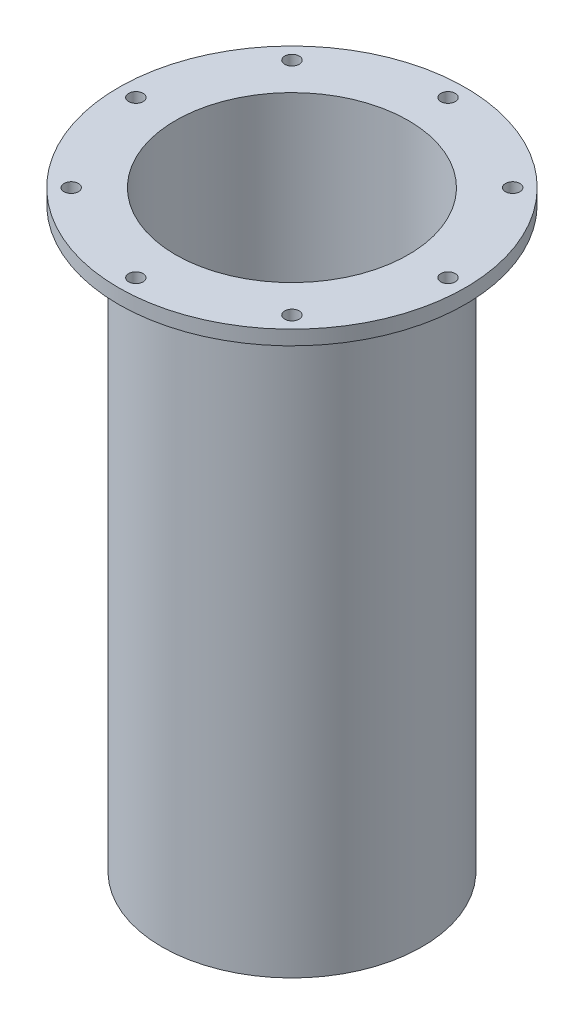
ISO-10303-21;
HEADER;
FILE_DESCRIPTION(('STEP AP214'),'2;1');
FILE_NAME('part.step','',(''),(''),'','','');
FILE_SCHEMA(('AUTOMOTIVE_DESIGN { 1 0 10303 214 1 1 1 1 }'));
ENDSEC;
DATA;
#1=APPLICATION_CONTEXT('core data for automotive mechanical design processes');
#2=APPLICATION_PROTOCOL_DEFINITION('international standard','automotive_design',2000,#1);
#3=PRODUCT_CONTEXT('',#1,'mechanical');
#4=PRODUCT('Part','Part','',(#3));
#5=PRODUCT_RELATED_PRODUCT_CATEGORY('part','',(#4));
#6=PRODUCT_DEFINITION_FORMATION('','',#4);
#7=PRODUCT_DEFINITION_CONTEXT('part definition',#1,'design');
#8=PRODUCT_DEFINITION('design','',#6,#7);
#9=PRODUCT_DEFINITION_SHAPE('','',#8);
#10=(LENGTH_UNIT() NAMED_UNIT(*) SI_UNIT(.MILLI.,.METRE.));
#11=(NAMED_UNIT(*) PLANE_ANGLE_UNIT() SI_UNIT($,.RADIAN.));
#12=(NAMED_UNIT(*) SI_UNIT($,.STERADIAN.) SOLID_ANGLE_UNIT());
#13=UNCERTAINTY_MEASURE_WITH_UNIT(LENGTH_MEASURE(1.E-05),#10,'distance_accuracy_value','');
#14=(GEOMETRIC_REPRESENTATION_CONTEXT(3) GLOBAL_UNCERTAINTY_ASSIGNED_CONTEXT((#13)) GLOBAL_UNIT_ASSIGNED_CONTEXT((#10,
#11,#12)) REPRESENTATION_CONTEXT('',''));
#15=CARTESIAN_POINT('',(0.,0.,0.));
#16=DIRECTION('',(0.,0.,1.));
#17=DIRECTION('',(1.,0.,0.));
#18=AXIS2_PLACEMENT_3D('',#15,#16,#17);
#19=CARTESIAN_POINT('',(0.,-260.35,0.));
#20=DIRECTION('',(0.,1.,0.));
#21=DIRECTION('',(0.,0.,1.));
#22=AXIS2_PLACEMENT_3D('',#19,#20,#21);
#23=CYLINDRICAL_SURFACE('',#22,57.15);
#24=CARTESIAN_POINT('',(0.,-260.35,0.));
#25=DIRECTION('',(0.,1.,0.));
#26=DIRECTION('',(0.,0.,1.));
#27=AXIS2_PLACEMENT_3D('',#24,#25,#26);
#28=CIRCLE('',#27,57.15);
#29=CARTESIAN_POINT('',(0.,-260.35,57.15));
#30=VERTEX_POINT('',#29);
#31=EDGE_CURVE('E10',#30,#30,#28,.T.);
#32=ORIENTED_EDGE('',*,*,#31,.T.);
#33=EDGE_LOOP('',(#32));
#34=FACE_BOUND('',#33,.T.);
#35=CARTESIAN_POINT('',(0.,-6.35000000000002,0.));
#36=DIRECTION('',(0.,1.,0.));
#37=DIRECTION('',(0.,0.,1.));
#38=AXIS2_PLACEMENT_3D('',#35,#36,#37);
#39=CIRCLE('',#38,57.15);
#40=CARTESIAN_POINT('',(0.,-6.35000000000002,57.15));
#41=VERTEX_POINT('',#40);
#42=EDGE_CURVE('E38',#41,#41,#39,.F.);
#43=ORIENTED_EDGE('',*,*,#42,.T.);
#44=EDGE_LOOP('',(#43));
#45=FACE_BOUND('',#44,.T.);
#46=ADVANCED_FACE('F35',(#34,#45),#23,.T.);
#47=CARTESIAN_POINT('',(0.,-260.35,0.));
#48=DIRECTION('',(0.,1.,0.));
#49=DIRECTION('',(0.,0.,1.));
#50=AXIS2_PLACEMENT_3D('',#47,#48,#49);
#51=PLANE('',#50);
#52=CARTESIAN_POINT('',(0.,-260.35,0.));
#53=DIRECTION('',(0.,1.,0.));
#54=DIRECTION('',(0.,0.,1.));
#55=AXIS2_PLACEMENT_3D('',#52,#53,#54);
#56=CIRCLE('',#55,51.1302);
#57=CARTESIAN_POINT('',(0.,-260.35,51.1302));
#58=VERTEX_POINT('',#57);
#59=EDGE_CURVE('E42',#58,#58,#56,.T.);
#60=ORIENTED_EDGE('',*,*,#59,.T.);
#61=EDGE_LOOP('',(#60));
#62=FACE_BOUND('',#61,.T.);
#63=ORIENTED_EDGE('',*,*,#31,.F.);
#64=EDGE_LOOP('',(#63));
#65=FACE_BOUND('',#64,.T.);
#66=ADVANCED_FACE('F113',(#62,#65),#51,.F.);
#67=CARTESIAN_POINT('',(0.,0.,0.));
#68=DIRECTION('',(0.,1.,0.));
#69=DIRECTION('',(0.,0.,1.));
#70=AXIS2_PLACEMENT_3D('',#67,#68,#69);
#71=PLANE('',#70);
#72=CARTESIAN_POINT('',(68.58,0.,2.39445790217862E-13));
#73=DIRECTION('',(0.,1.,0.));
#74=DIRECTION('',(-1.,0.,0.));
#75=AXIS2_PLACEMENT_3D('',#72,#73,#74);
#76=CIRCLE('',#75,3.175);
#77=CARTESIAN_POINT('',(65.405,0.,2.28360336967035E-13));
#78=VERTEX_POINT('',#77);
#79=EDGE_CURVE('E87',#78,#78,#76,.T.);
#80=ORIENTED_EDGE('',*,*,#79,.F.);
#81=EDGE_LOOP('',(#80));
#82=FACE_BOUND('',#81,.T.);
#83=CARTESIAN_POINT('',(48.4933830537732,0.,48.4933830537737));
#84=DIRECTION('',(0.,1.,0.));
#85=DIRECTION('',(-0.707106781186544,0.,-0.707106781186551));
#86=AXIS2_PLACEMENT_3D('',#83,#84,#85);
#87=CIRCLE('',#86,3.175);
#88=CARTESIAN_POINT('',(46.2483190235059,0.,46.2483190235064));
#89=VERTEX_POINT('',#88);
#90=EDGE_CURVE('E81',#89,#89,#87,.T.);
#91=ORIENTED_EDGE('',*,*,#90,.F.);
#92=EDGE_LOOP('',(#91));
#93=FACE_BOUND('',#92,.T.);
#94=CARTESIAN_POINT('',(0.,0.,68.58));
#95=DIRECTION('',(0.,1.,0.));
#96=DIRECTION('',(0.,0.,-1.));
#97=AXIS2_PLACEMENT_3D('',#94,#95,#96);
#98=CIRCLE('',#97,3.175);
#99=CARTESIAN_POINT('',(0.,0.,65.405));
#100=VERTEX_POINT('',#99);
#101=EDGE_CURVE('E73',#100,#100,#98,.T.);
#102=ORIENTED_EDGE('',*,*,#101,.F.);
#103=EDGE_LOOP('',(#102));
#104=FACE_BOUND('',#103,.T.);
#105=CARTESIAN_POINT('',(-48.4933830537739,0.,48.493383053773));
#106=DIRECTION('',(0.,1.,0.));
#107=DIRECTION('',(0.707106781186554,0.,-0.707106781186541));
#108=AXIS2_PLACEMENT_3D('',#105,#106,#107);
#109=CIRCLE('',#108,3.175);
#110=CARTESIAN_POINT('',(-46.2483190235065,0.,46.2483190235057));
#111=VERTEX_POINT('',#110);
#112=EDGE_CURVE('E74',#111,#111,#109,.T.);
#113=ORIENTED_EDGE('',*,*,#112,.F.);
#114=EDGE_LOOP('',(#113));
#115=FACE_BOUND('',#114,.T.);
#116=CARTESIAN_POINT('',(-68.58,0.,-7.18337370653586E-13));
#117=DIRECTION('',(0.,1.,0.));
#118=DIRECTION('',(1.,0.,0.));
#119=AXIS2_PLACEMENT_3D('',#116,#117,#118);
#120=CIRCLE('',#119,3.175);
#121=CARTESIAN_POINT('',(-65.405,0.,-6.85081010901105E-13));
#122=VERTEX_POINT('',#121);
#123=EDGE_CURVE('E97',#122,#122,#120,.T.);
#124=ORIENTED_EDGE('',*,*,#123,.F.);
#125=EDGE_LOOP('',(#124));
#126=FACE_BOUND('',#125,.T.);
#127=CARTESIAN_POINT('',(-48.4933830537728,0.,-48.493383053774));
#128=DIRECTION('',(0.,1.,0.));
#129=DIRECTION('',(0.707106781186539,0.,0.707106781186556));
#130=AXIS2_PLACEMENT_3D('',#127,#128,#129);
#131=CIRCLE('',#130,3.175);
#132=CARTESIAN_POINT('',(-46.2483190235056,0.,-46.2483190235067));
#133=VERTEX_POINT('',#132);
#134=EDGE_CURVE('E98',#133,#133,#131,.T.);
#135=ORIENTED_EDGE('',*,*,#134,.F.);
#136=EDGE_LOOP('',(#135));
#137=FACE_BOUND('',#136,.T.);
#138=CARTESIAN_POINT('',(48.4933830537735,0.,-48.4933830537733));
#139=DIRECTION('',(0.,1.,0.));
#140=DIRECTION('',(-0.707106781186549,0.,0.707106781186546));
#141=AXIS2_PLACEMENT_3D('',#138,#139,#140);
#142=CIRCLE('',#141,3.175);
#143=CARTESIAN_POINT('',(46.2483190235062,0.,-46.2483190235061));
#144=VERTEX_POINT('',#143);
#145=EDGE_CURVE('E66',#144,#144,#142,.T.);
#146=ORIENTED_EDGE('',*,*,#145,.F.);
#147=EDGE_LOOP('',(#146));
#148=FACE_BOUND('',#147,.T.);
#149=CARTESIAN_POINT('',(0.,0.,-68.58));
#150=DIRECTION('',(0.,1.,0.));
#151=DIRECTION('',(0.,0.,1.));
#152=AXIS2_PLACEMENT_3D('',#149,#150,#151);
#153=CIRCLE('',#152,3.175);
#154=CARTESIAN_POINT('',(0.,0.,-65.405));
#155=VERTEX_POINT('',#154);
#156=EDGE_CURVE('E60',#155,#155,#153,.T.);
#157=ORIENTED_EDGE('',*,*,#156,.F.);
#158=EDGE_LOOP('',(#157));
#159=FACE_BOUND('',#158,.T.);
#160=CARTESIAN_POINT('',(0.,0.,0.));
#161=DIRECTION('',(0.,1.,0.));
#162=DIRECTION('',(0.,0.,1.));
#163=AXIS2_PLACEMENT_3D('',#160,#161,#162);
#164=CIRCLE('',#163,51.1302);
#165=CARTESIAN_POINT('',(0.,0.,51.1302));
#166=VERTEX_POINT('',#165);
#167=EDGE_CURVE('E46',#166,#166,#164,.T.);
#168=ORIENTED_EDGE('',*,*,#167,.F.);
#169=EDGE_LOOP('',(#168));
#170=FACE_BOUND('',#169,.T.);
#171=CARTESIAN_POINT('',(0.,0.,0.));
#172=DIRECTION('',(0.,1.,0.));
#173=DIRECTION('',(0.,0.,1.));
#174=AXIS2_PLACEMENT_3D('',#171,#172,#173);
#175=CIRCLE('',#174,76.2);
#176=CARTESIAN_POINT('',(0.,0.,76.2));
#177=VERTEX_POINT('',#176);
#178=EDGE_CURVE('E51',#177,#177,#175,.T.);
#179=ORIENTED_EDGE('',*,*,#178,.T.);
#180=EDGE_LOOP('',(#179));
#181=FACE_BOUND('',#180,.T.);
#182=ADVANCED_FACE('F109',(#82,#93,#104,#115,#126,#137,#148,#159,#170,#181),#71,.T.);
#183=CARTESIAN_POINT('',(0.,-260.35,0.));
#184=DIRECTION('',(0.,1.,0.));
#185=DIRECTION('',(0.,0.,1.));
#186=AXIS2_PLACEMENT_3D('',#183,#184,#185);
#187=CYLINDRICAL_SURFACE('',#186,51.1302);
#188=ORIENTED_EDGE('',*,*,#59,.F.);
#189=EDGE_LOOP('',(#188));
#190=FACE_BOUND('',#189,.T.);
#191=ORIENTED_EDGE('',*,*,#167,.T.);
#192=EDGE_LOOP('',(#191));
#193=FACE_BOUND('',#192,.T.);
#194=ADVANCED_FACE('F112',(#190,#193),#187,.F.);
#195=CARTESIAN_POINT('',(0.,-6.35,0.));
#196=DIRECTION('',(0.,1.,0.));
#197=DIRECTION('',(0.,0.,1.));
#198=AXIS2_PLACEMENT_3D('',#195,#196,#197);
#199=CYLINDRICAL_SURFACE('',#198,76.2);
#200=CARTESIAN_POINT('',(0.,-6.35,0.));
#201=DIRECTION('',(0.,1.,0.));
#202=DIRECTION('',(0.,0.,1.));
#203=AXIS2_PLACEMENT_3D('',#200,#201,#202);
#204=CIRCLE('',#203,76.2);
#205=CARTESIAN_POINT('',(0.,-6.35,76.2));
#206=VERTEX_POINT('',#205);
#207=EDGE_CURVE('E54',#206,#206,#204,.T.);
#208=ORIENTED_EDGE('',*,*,#207,.T.);
#209=EDGE_LOOP('',(#208));
#210=FACE_BOUND('',#209,.T.);
#211=ORIENTED_EDGE('',*,*,#178,.F.);
#212=EDGE_LOOP('',(#211));
#213=FACE_BOUND('',#212,.T.);
#214=ADVANCED_FACE('F125',(#210,#213),#199,.T.);
#215=CARTESIAN_POINT('',(0.,-6.35,0.));
#216=DIRECTION('',(0.,1.,0.));
#217=DIRECTION('',(0.,0.,1.));
#218=AXIS2_PLACEMENT_3D('',#215,#216,#217);
#219=PLANE('',#218);
#220=CARTESIAN_POINT('',(68.58,-6.35000000000002,2.39445790217862E-13));
#221=DIRECTION('',(0.,1.,0.));
#222=DIRECTION('',(0.,0.,1.));
#223=AXIS2_PLACEMENT_3D('',#220,#221,#222);
#224=CIRCLE('',#223,3.175);
#225=CARTESIAN_POINT('',(68.58,-6.35000000000002,3.17500000000024));
#226=VERTEX_POINT('',#225);
#227=EDGE_CURVE('E69',#226,#226,#224,.F.);
#228=ORIENTED_EDGE('',*,*,#227,.F.);
#229=EDGE_LOOP('',(#228));
#230=FACE_BOUND('',#229,.T.);
#231=CARTESIAN_POINT('',(48.4933830537732,-6.35000000000002,48.4933830537737));
#232=DIRECTION('',(0.,1.,0.));
#233=DIRECTION('',(0.,0.,1.));
#234=AXIS2_PLACEMENT_3D('',#231,#232,#233);
#235=CIRCLE('',#234,3.175);
#236=CARTESIAN_POINT('',(48.4933830537732,-6.35000000000002,51.6683830537737));
#237=VERTEX_POINT('',#236);
#238=EDGE_CURVE('E84',#237,#237,#235,.F.);
#239=ORIENTED_EDGE('',*,*,#238,.F.);
#240=EDGE_LOOP('',(#239));
#241=FACE_BOUND('',#240,.T.);
#242=CARTESIAN_POINT('',(0.,-6.35000000000002,68.58));
#243=DIRECTION('',(0.,1.,0.));
#244=DIRECTION('',(0.,0.,1.));
#245=AXIS2_PLACEMENT_3D('',#242,#243,#244);
#246=CIRCLE('',#245,3.175);
#247=CARTESIAN_POINT('',(0.,-6.35000000000002,71.755));
#248=VERTEX_POINT('',#247);
#249=EDGE_CURVE('E78',#248,#248,#246,.F.);
#250=ORIENTED_EDGE('',*,*,#249,.F.);
#251=EDGE_LOOP('',(#250));
#252=FACE_BOUND('',#251,.T.);
#253=CARTESIAN_POINT('',(-48.4933830537739,-6.35000000000002,48.493383053773));
#254=DIRECTION('',(0.,1.,0.));
#255=DIRECTION('',(0.,0.,1.));
#256=AXIS2_PLACEMENT_3D('',#253,#254,#255);
#257=CIRCLE('',#256,3.175);
#258=CARTESIAN_POINT('',(-48.4933830537739,-6.35000000000002,51.668383053773));
#259=VERTEX_POINT('',#258);
#260=EDGE_CURVE('E70',#259,#259,#257,.F.);
#261=ORIENTED_EDGE('',*,*,#260,.F.);
#262=EDGE_LOOP('',(#261));
#263=FACE_BOUND('',#262,.T.);
#264=CARTESIAN_POINT('',(-68.58,-6.35000000000002,-7.18337370653586E-13));
#265=DIRECTION('',(0.,1.,0.));
#266=DIRECTION('',(0.,0.,1.));
#267=AXIS2_PLACEMENT_3D('',#264,#265,#266);
#268=CIRCLE('',#267,3.175);
#269=CARTESIAN_POINT('',(-68.58,-6.35000000000002,3.17499999999928));
#270=VERTEX_POINT('',#269);
#271=EDGE_CURVE('E77',#270,#270,#268,.F.);
#272=ORIENTED_EDGE('',*,*,#271,.F.);
#273=EDGE_LOOP('',(#272));
#274=FACE_BOUND('',#273,.T.);
#275=CARTESIAN_POINT('',(-48.4933830537728,-6.35000000000002,-48.493383053774));
#276=DIRECTION('',(0.,1.,0.));
#277=DIRECTION('',(0.,0.,1.));
#278=AXIS2_PLACEMENT_3D('',#275,#276,#277);
#279=CIRCLE('',#278,3.175);
#280=CARTESIAN_POINT('',(-48.4933830537728,-6.35000000000002,-45.318383053774));
#281=VERTEX_POINT('',#280);
#282=EDGE_CURVE('E94',#281,#281,#279,.F.);
#283=ORIENTED_EDGE('',*,*,#282,.F.);
#284=EDGE_LOOP('',(#283));
#285=FACE_BOUND('',#284,.T.);
#286=CARTESIAN_POINT('',(48.4933830537735,-6.35000000000002,-48.4933830537733));
#287=DIRECTION('',(0.,1.,0.));
#288=DIRECTION('',(0.,0.,1.));
#289=AXIS2_PLACEMENT_3D('',#286,#287,#288);
#290=CIRCLE('',#289,3.175);
#291=CARTESIAN_POINT('',(48.4933830537735,-6.35000000000002,-45.3183830537734));
#292=VERTEX_POINT('',#291);
#293=EDGE_CURVE('E63',#292,#292,#290,.F.);
#294=ORIENTED_EDGE('',*,*,#293,.F.);
#295=EDGE_LOOP('',(#294));
#296=FACE_BOUND('',#295,.T.);
#297=CARTESIAN_POINT('',(0.,-6.35000000000002,-68.58));
#298=DIRECTION('',(0.,1.,0.));
#299=DIRECTION('',(0.,0.,1.));
#300=AXIS2_PLACEMENT_3D('',#297,#298,#299);
#301=CIRCLE('',#300,3.175);
#302=CARTESIAN_POINT('',(0.,-6.35000000000002,-65.405));
#303=VERTEX_POINT('',#302);
#304=EDGE_CURVE('E55',#303,#303,#301,.F.);
#305=ORIENTED_EDGE('',*,*,#304,.F.);
#306=EDGE_LOOP('',(#305));
#307=FACE_BOUND('',#306,.T.);
#308=ORIENTED_EDGE('',*,*,#42,.F.);
#309=EDGE_LOOP('',(#308));
#310=FACE_BOUND('',#309,.T.);
#311=ORIENTED_EDGE('',*,*,#207,.F.);
#312=EDGE_LOOP('',(#311));
#313=FACE_BOUND('',#312,.T.);
#314=ADVANCED_FACE('F127',(#230,#241,#252,#263,#274,#285,#296,#307,#310,#313),#219,.F.);
#315=CARTESIAN_POINT('',(0.,-260.351,-68.58));
#316=DIRECTION('',(0.,1.,0.));
#317=DIRECTION('',(0.,0.,1.));
#318=AXIS2_PLACEMENT_3D('',#315,#316,#317);
#319=CYLINDRICAL_SURFACE('',#318,3.175);
#320=ORIENTED_EDGE('',*,*,#156,.T.);
#321=EDGE_LOOP('',(#320));
#322=FACE_BOUND('',#321,.T.);
#323=ORIENTED_EDGE('',*,*,#304,.T.);
#324=EDGE_LOOP('',(#323));
#325=FACE_BOUND('',#324,.T.);
#326=ADVANCED_FACE('F134',(#322,#325),#319,.F.);
#327=CARTESIAN_POINT('',(48.4933830537735,-260.351,-48.4933830537733));
#328=DIRECTION('',(0.,1.,0.));
#329=DIRECTION('',(0.,0.,1.));
#330=AXIS2_PLACEMENT_3D('',#327,#328,#329);
#331=CYLINDRICAL_SURFACE('',#330,3.175);
#332=ORIENTED_EDGE('',*,*,#145,.T.);
#333=EDGE_LOOP('',(#332));
#334=FACE_BOUND('',#333,.T.);
#335=ORIENTED_EDGE('',*,*,#293,.T.);
#336=EDGE_LOOP('',(#335));
#337=FACE_BOUND('',#336,.T.);
#338=ADVANCED_FACE('F183',(#334,#337),#331,.F.);
#339=CARTESIAN_POINT('',(-48.4933830537728,-260.351,-48.493383053774));
#340=DIRECTION('',(0.,1.,0.));
#341=DIRECTION('',(0.,0.,1.));
#342=AXIS2_PLACEMENT_3D('',#339,#340,#341);
#343=CYLINDRICAL_SURFACE('',#342,3.175);
#344=ORIENTED_EDGE('',*,*,#134,.T.);
#345=EDGE_LOOP('',(#344));
#346=FACE_BOUND('',#345,.T.);
#347=ORIENTED_EDGE('',*,*,#282,.T.);
#348=EDGE_LOOP('',(#347));
#349=FACE_BOUND('',#348,.T.);
#350=ADVANCED_FACE('F195',(#346,#349),#343,.F.);
#351=CARTESIAN_POINT('',(-68.58,-260.351,-7.18337370653586E-13));
#352=DIRECTION('',(0.,1.,0.));
#353=DIRECTION('',(0.,0.,1.));
#354=AXIS2_PLACEMENT_3D('',#351,#352,#353);
#355=CYLINDRICAL_SURFACE('',#354,3.175);
#356=ORIENTED_EDGE('',*,*,#123,.T.);
#357=EDGE_LOOP('',(#356));
#358=FACE_BOUND('',#357,.T.);
#359=ORIENTED_EDGE('',*,*,#271,.T.);
#360=EDGE_LOOP('',(#359));
#361=FACE_BOUND('',#360,.T.);
#362=ADVANCED_FACE('F106',(#358,#361),#355,.F.);
#363=CARTESIAN_POINT('',(-48.4933830537739,-260.351,48.493383053773));
#364=DIRECTION('',(0.,1.,0.));
#365=DIRECTION('',(0.,0.,1.));
#366=AXIS2_PLACEMENT_3D('',#363,#364,#365);
#367=CYLINDRICAL_SURFACE('',#366,3.175);
#368=ORIENTED_EDGE('',*,*,#112,.T.);
#369=EDGE_LOOP('',(#368));
#370=FACE_BOUND('',#369,.T.);
#371=ORIENTED_EDGE('',*,*,#260,.T.);
#372=EDGE_LOOP('',(#371));
#373=FACE_BOUND('',#372,.T.);
#374=ADVANCED_FACE('F209',(#370,#373),#367,.F.);
#375=CARTESIAN_POINT('',(0.,-260.351,68.58));
#376=DIRECTION('',(0.,1.,0.));
#377=DIRECTION('',(0.,0.,1.));
#378=AXIS2_PLACEMENT_3D('',#375,#376,#377);
#379=CYLINDRICAL_SURFACE('',#378,3.175);
#380=ORIENTED_EDGE('',*,*,#101,.T.);
#381=EDGE_LOOP('',(#380));
#382=FACE_BOUND('',#381,.T.);
#383=ORIENTED_EDGE('',*,*,#249,.T.);
#384=EDGE_LOOP('',(#383));
#385=FACE_BOUND('',#384,.T.);
#386=ADVANCED_FACE('F216',(#382,#385),#379,.F.);
#387=CARTESIAN_POINT('',(48.4933830537732,-260.351,48.4933830537737));
#388=DIRECTION('',(0.,1.,0.));
#389=DIRECTION('',(0.,0.,1.));
#390=AXIS2_PLACEMENT_3D('',#387,#388,#389);
#391=CYLINDRICAL_SURFACE('',#390,3.175);
#392=ORIENTED_EDGE('',*,*,#90,.T.);
#393=EDGE_LOOP('',(#392));
#394=FACE_BOUND('',#393,.T.);
#395=ORIENTED_EDGE('',*,*,#238,.T.);
#396=EDGE_LOOP('',(#395));
#397=FACE_BOUND('',#396,.T.);
#398=ADVANCED_FACE('F224',(#394,#397),#391,.F.);
#399=CARTESIAN_POINT('',(68.58,-260.351,2.39445790217862E-13));
#400=DIRECTION('',(0.,1.,0.));
#401=DIRECTION('',(0.,0.,1.));
#402=AXIS2_PLACEMENT_3D('',#399,#400,#401);
#403=CYLINDRICAL_SURFACE('',#402,3.175);
#404=ORIENTED_EDGE('',*,*,#79,.T.);
#405=EDGE_LOOP('',(#404));
#406=FACE_BOUND('',#405,.T.);
#407=ORIENTED_EDGE('',*,*,#227,.T.);
#408=EDGE_LOOP('',(#407));
#409=FACE_BOUND('',#408,.T.);
#410=ADVANCED_FACE('F232',(#406,#409),#403,.F.);
#411=CLOSED_SHELL('',(#46,#66,#182,#194,#214,#314,#326,#338,#350,#362,#374,#386,#398,#410));
#412=MANIFOLD_SOLID_BREP('B2',#411);
#413=ADVANCED_BREP_SHAPE_REPRESENTATION('',(#18,#412),#14);
#414=SHAPE_DEFINITION_REPRESENTATION(#9,#413);
ENDSEC;
END-ISO-10303-21;
